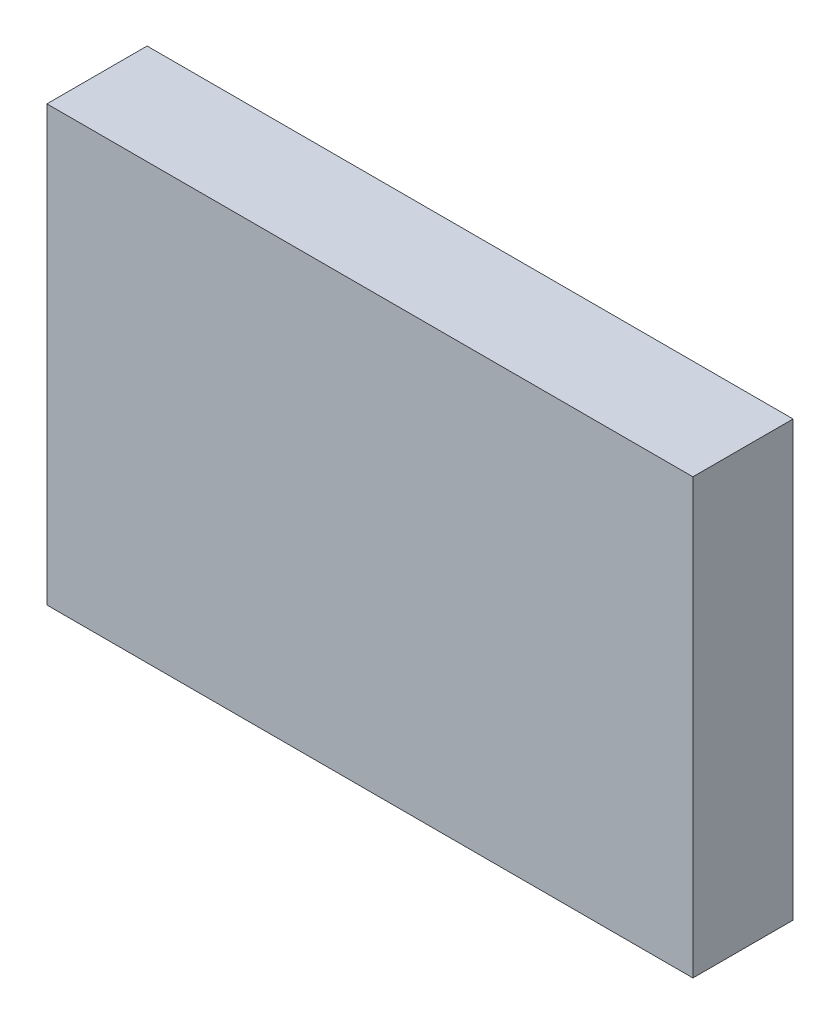
ISO-10303-21;
HEADER;
FILE_DESCRIPTION(('STEP AP214'),'2;1');
FILE_NAME('part.step','',(''),(''),'','','');
FILE_SCHEMA(('AUTOMOTIVE_DESIGN { 1 0 10303 214 1 1 1 1 }'));
ENDSEC;
DATA;
#1=APPLICATION_CONTEXT('core data for automotive mechanical design processes');
#2=APPLICATION_PROTOCOL_DEFINITION('international standard','automotive_design',2000,#1);
#3=PRODUCT_CONTEXT('',#1,'mechanical');
#4=PRODUCT('Part','Part','',(#3));
#5=PRODUCT_RELATED_PRODUCT_CATEGORY('part','',(#4));
#6=PRODUCT_DEFINITION_FORMATION('','',#4);
#7=PRODUCT_DEFINITION_CONTEXT('part definition',#1,'design');
#8=PRODUCT_DEFINITION('design','',#6,#7);
#9=PRODUCT_DEFINITION_SHAPE('','',#8);
#10=(LENGTH_UNIT() NAMED_UNIT(*) SI_UNIT(.MILLI.,.METRE.));
#11=(NAMED_UNIT(*) PLANE_ANGLE_UNIT() SI_UNIT($,.RADIAN.));
#12=(NAMED_UNIT(*) SI_UNIT($,.STERADIAN.) SOLID_ANGLE_UNIT());
#13=UNCERTAINTY_MEASURE_WITH_UNIT(LENGTH_MEASURE(1.E-05),#10,'distance_accuracy_value','');
#14=(GEOMETRIC_REPRESENTATION_CONTEXT(3) GLOBAL_UNCERTAINTY_ASSIGNED_CONTEXT((#13)) GLOBAL_UNIT_ASSIGNED_CONTEXT((#10,
#11,#12)) REPRESENTATION_CONTEXT('',''));
#15=CARTESIAN_POINT('',(0.,0.,0.));
#16=DIRECTION('',(0.,0.,1.));
#17=DIRECTION('',(1.,0.,0.));
#18=AXIS2_PLACEMENT_3D('',#15,#16,#17);
#19=CARTESIAN_POINT('',(-0.0635,-2.5,13.5));
#20=DIRECTION('',(1.,0.,0.));
#21=DIRECTION('',(0.,0.,-1.));
#22=AXIS2_PLACEMENT_3D('',#19,#20,#21);
#23=PLANE('',#22);
#24=DIRECTION('',(0.,-1.,0.));
#25=VECTOR('',#24,1.);
#26=CARTESIAN_POINT('',(-0.0635,-2.5,0.));
#27=LINE('',#26,#25);
#28=CARTESIAN_POINT('',(-0.0635,56.,0.));
#29=VERTEX_POINT('',#28);
#30=CARTESIAN_POINT('',(-0.0635,-2.5,0.));
#31=VERTEX_POINT('',#30);
#32=EDGE_CURVE('E104',#29,#31,#27,.T.);
#33=ORIENTED_EDGE('',*,*,#32,.T.);
#34=DIRECTION('',(0.,0.,-1.));
#35=VECTOR('',#34,1.);
#36=CARTESIAN_POINT('',(-0.0635,-2.5,13.5));
#37=LINE('',#36,#35);
#38=CARTESIAN_POINT('',(-0.0635,-2.5,13.5));
#39=VERTEX_POINT('',#38);
#40=EDGE_CURVE('E11',#39,#31,#37,.T.);
#41=ORIENTED_EDGE('',*,*,#40,.F.);
#42=DIRECTION('',(0.,-1.,0.));
#43=VECTOR('',#42,1.);
#44=CARTESIAN_POINT('',(-0.0635,-2.5,13.5));
#45=LINE('',#44,#43);
#46=CARTESIAN_POINT('',(-0.0635,56.,13.5));
#47=VERTEX_POINT('',#46);
#48=EDGE_CURVE('E91',#47,#39,#45,.T.);
#49=ORIENTED_EDGE('',*,*,#48,.F.);
#50=DIRECTION('',(0.,0.,-1.));
#51=VECTOR('',#50,1.);
#52=CARTESIAN_POINT('',(-0.0635,56.,13.5));
#53=LINE('',#52,#51);
#54=EDGE_CURVE('E100',#47,#29,#53,.T.);
#55=ORIENTED_EDGE('',*,*,#54,.T.);
#56=EDGE_LOOP('',(#33,#41,#49,#55));
#57=FACE_BOUND('',#56,.T.);
#58=ADVANCED_FACE('F38',(#57),#23,.F.);
#59=CARTESIAN_POINT('',(87.,-2.5,13.5));
#60=DIRECTION('',(0.,1.,0.));
#61=DIRECTION('',(0.,0.,1.));
#62=AXIS2_PLACEMENT_3D('',#59,#60,#61);
#63=PLANE('',#62);
#64=DIRECTION('',(1.,0.,0.));
#65=VECTOR('',#64,1.);
#66=CARTESIAN_POINT('',(87.,-2.5,0.));
#67=LINE('',#66,#65);
#68=CARTESIAN_POINT('',(87.,-2.5,0.));
#69=VERTEX_POINT('',#68);
#70=EDGE_CURVE('E95',#31,#69,#67,.T.);
#71=ORIENTED_EDGE('',*,*,#70,.T.);
#72=DIRECTION('',(0.,0.,-1.));
#73=VECTOR('',#72,1.);
#74=CARTESIAN_POINT('',(87.,-2.5,13.5));
#75=LINE('',#74,#73);
#76=CARTESIAN_POINT('',(87.,-2.5,13.5));
#77=VERTEX_POINT('',#76);
#78=EDGE_CURVE('E46',#77,#69,#75,.T.);
#79=ORIENTED_EDGE('',*,*,#78,.F.);
#80=DIRECTION('',(1.,0.,0.));
#81=VECTOR('',#80,1.);
#82=CARTESIAN_POINT('',(87.,-2.5,13.5));
#83=LINE('',#82,#81);
#84=EDGE_CURVE('E86',#39,#77,#83,.T.);
#85=ORIENTED_EDGE('',*,*,#84,.F.);
#86=ORIENTED_EDGE('',*,*,#40,.T.);
#87=EDGE_LOOP('',(#71,#79,#85,#86));
#88=FACE_BOUND('',#87,.T.);
#89=ADVANCED_FACE('F94',(#88),#63,.F.);
#90=CARTESIAN_POINT('',(87.,56.,13.5));
#91=DIRECTION('',(-1.,0.,0.));
#92=DIRECTION('',(0.,0.,1.));
#93=AXIS2_PLACEMENT_3D('',#90,#91,#92);
#94=PLANE('',#93);
#95=DIRECTION('',(0.,1.,0.));
#96=VECTOR('',#95,1.);
#97=CARTESIAN_POINT('',(87.,56.,0.));
#98=LINE('',#97,#96);
#99=CARTESIAN_POINT('',(87.,56.,0.));
#100=VERTEX_POINT('',#99);
#101=EDGE_CURVE('E73',#69,#100,#98,.T.);
#102=ORIENTED_EDGE('',*,*,#101,.T.);
#103=DIRECTION('',(0.,0.,-1.));
#104=VECTOR('',#103,1.);
#105=CARTESIAN_POINT('',(87.,56.,13.5));
#106=LINE('',#105,#104);
#107=CARTESIAN_POINT('',(87.,56.,13.5));
#108=VERTEX_POINT('',#107);
#109=EDGE_CURVE('E96',#108,#100,#106,.T.);
#110=ORIENTED_EDGE('',*,*,#109,.F.);
#111=DIRECTION('',(0.,1.,0.));
#112=VECTOR('',#111,1.);
#113=CARTESIAN_POINT('',(87.,56.,13.5));
#114=LINE('',#113,#112);
#115=EDGE_CURVE('E89',#77,#108,#114,.T.);
#116=ORIENTED_EDGE('',*,*,#115,.F.);
#117=ORIENTED_EDGE('',*,*,#78,.T.);
#118=EDGE_LOOP('',(#102,#110,#116,#117));
#119=FACE_BOUND('',#118,.T.);
#120=ADVANCED_FACE('F97',(#119),#94,.F.);
#121=CARTESIAN_POINT('',(-0.0635,56.,13.5));
#122=DIRECTION('',(0.,-1.,0.));
#123=DIRECTION('',(0.,0.,-1.));
#124=AXIS2_PLACEMENT_3D('',#121,#122,#123);
#125=PLANE('',#124);
#126=DIRECTION('',(-1.,0.,0.));
#127=VECTOR('',#126,1.);
#128=CARTESIAN_POINT('',(-0.0635,56.,0.));
#129=LINE('',#128,#127);
#130=EDGE_CURVE('E79',#100,#29,#129,.T.);
#131=ORIENTED_EDGE('',*,*,#130,.T.);
#132=ORIENTED_EDGE('',*,*,#54,.F.);
#133=DIRECTION('',(-1.,0.,0.));
#134=VECTOR('',#133,1.);
#135=CARTESIAN_POINT('',(-0.0635,56.,13.5));
#136=LINE('',#135,#134);
#137=EDGE_CURVE('E56',#108,#47,#136,.T.);
#138=ORIENTED_EDGE('',*,*,#137,.F.);
#139=ORIENTED_EDGE('',*,*,#109,.T.);
#140=EDGE_LOOP('',(#131,#132,#138,#139));
#141=FACE_BOUND('',#140,.T.);
#142=ADVANCED_FACE('F114',(#141),#125,.F.);
#143=CARTESIAN_POINT('',(0.,0.,13.5));
#144=DIRECTION('',(0.,0.,-1.));
#145=DIRECTION('',(-1.,0.,0.));
#146=AXIS2_PLACEMENT_3D('',#143,#144,#145);
#147=PLANE('',#146);
#148=ORIENTED_EDGE('',*,*,#48,.T.);
#149=ORIENTED_EDGE('',*,*,#84,.T.);
#150=ORIENTED_EDGE('',*,*,#115,.T.);
#151=ORIENTED_EDGE('',*,*,#137,.T.);
#152=EDGE_LOOP('',(#148,#149,#150,#151));
#153=FACE_BOUND('',#152,.T.);
#154=ADVANCED_FACE('F87',(#153),#147,.F.);
#155=CARTESIAN_POINT('',(0.,0.,0.));
#156=DIRECTION('',(0.,0.,-1.));
#157=DIRECTION('',(-1.,0.,0.));
#158=AXIS2_PLACEMENT_3D('',#155,#156,#157);
#159=PLANE('',#158);
#160=ORIENTED_EDGE('',*,*,#32,.F.);
#161=ORIENTED_EDGE('',*,*,#130,.F.);
#162=ORIENTED_EDGE('',*,*,#101,.F.);
#163=ORIENTED_EDGE('',*,*,#70,.F.);
#164=EDGE_LOOP('',(#160,#161,#162,#163));
#165=FACE_BOUND('',#164,.T.);
#166=ADVANCED_FACE('F117',(#165),#159,.T.);
#167=CLOSED_SHELL('',(#58,#89,#120,#142,#154,#166));
#168=MANIFOLD_SOLID_BREP('B2',#167);
#169=ADVANCED_BREP_SHAPE_REPRESENTATION('',(#18,#168),#14);
#170=SHAPE_DEFINITION_REPRESENTATION(#9,#169);
ENDSEC;
END-ISO-10303-21;
